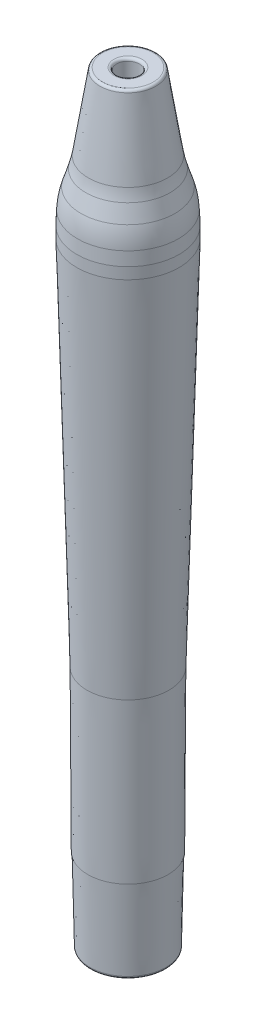
ISO-10303-21;
HEADER;
FILE_DESCRIPTION(('STEP AP214'),'2;1');
FILE_NAME('part.step','',(''),(''),'','','');
FILE_SCHEMA(('AUTOMOTIVE_DESIGN { 1 0 10303 214 1 1 1 1 }'));
ENDSEC;
DATA;
#1=APPLICATION_CONTEXT('core data for automotive mechanical design processes');
#2=APPLICATION_PROTOCOL_DEFINITION('international standard','automotive_design',2000,#1);
#3=PRODUCT_CONTEXT('',#1,'mechanical');
#4=PRODUCT('Part','Part','',(#3));
#5=PRODUCT_RELATED_PRODUCT_CATEGORY('part','',(#4));
#6=PRODUCT_DEFINITION_FORMATION('','',#4);
#7=PRODUCT_DEFINITION_CONTEXT('part definition',#1,'design');
#8=PRODUCT_DEFINITION('design','',#6,#7);
#9=PRODUCT_DEFINITION_SHAPE('','',#8);
#10=(LENGTH_UNIT() NAMED_UNIT(*) SI_UNIT(.MILLI.,.METRE.));
#11=(NAMED_UNIT(*) PLANE_ANGLE_UNIT() SI_UNIT($,.RADIAN.));
#12=(NAMED_UNIT(*) SI_UNIT($,.STERADIAN.) SOLID_ANGLE_UNIT());
#13=UNCERTAINTY_MEASURE_WITH_UNIT(LENGTH_MEASURE(1.E-05),#10,'distance_accuracy_value','');
#14=(GEOMETRIC_REPRESENTATION_CONTEXT(3) GLOBAL_UNCERTAINTY_ASSIGNED_CONTEXT((#13)) GLOBAL_UNIT_ASSIGNED_CONTEXT((#10,
#11,#12)) REPRESENTATION_CONTEXT('',''));
#15=CARTESIAN_POINT('',(0.,0.,0.));
#16=DIRECTION('',(0.,0.,1.));
#17=DIRECTION('',(1.,0.,0.));
#18=AXIS2_PLACEMENT_3D('',#15,#16,#17);
#19=CARTESIAN_POINT('',(14.187329425958,38.6453014595179,0.));
#20=DIRECTION('',(0.,1.,0.));
#21=DIRECTION('',(-1.,0.,0.));
#22=AXIS2_PLACEMENT_3D('',#19,#20,#21);
#23=CONICAL_SURFACE('',#22,9.44,0.0272708049812827);
#24=CARTESIAN_POINT('',(14.187329425958,-29.9091987574628,0.));
#25=DIRECTION('',(0.,-1.,0.));
#26=DIRECTION('',(1.,0.,0.));
#27=AXIS2_PLACEMENT_3D('',#24,#25,#26);
#28=CIRCLE('',#27,7.57000000000001);
#29=CARTESIAN_POINT('',(21.7573294259581,-29.9091987574628,0.));
#30=VERTEX_POINT('',#29);
#31=EDGE_CURVE('E74',#30,#30,#28,.T.);
#32=ORIENTED_EDGE('',*,*,#31,.F.);
#33=EDGE_LOOP('',(#32));
#34=FACE_BOUND('',#33,.T.);
#35=CARTESIAN_POINT('',(14.187329425958,38.6453014595179,0.));
#36=DIRECTION('',(0.,1.,0.));
#37=DIRECTION('',(0.,0.,1.));
#38=AXIS2_PLACEMENT_3D('',#35,#36,#37);
#39=CIRCLE('',#38,9.44);
#40=CARTESIAN_POINT('',(14.187329425958,38.6453014595179,9.44));
#41=VERTEX_POINT('',#40);
#42=EDGE_CURVE('E77',#41,#41,#39,.T.);
#43=ORIENTED_EDGE('',*,*,#42,.F.);
#44=EDGE_LOOP('',(#43));
#45=FACE_BOUND('',#44,.T.);
#46=ADVANCED_FACE('F48',(#34,#45),#23,.T.);
#47=CARTESIAN_POINT('',(14.187329425958,40.7453014595179,0.));
#48=DIRECTION('',(0.,1.,0.));
#49=DIRECTION('',(0.,0.,1.));
#50=AXIS2_PLACEMENT_3D('',#47,#48,#49);
#51=CYLINDRICAL_SURFACE('',#50,9.44);
#52=CARTESIAN_POINT('',(14.187329425958,40.7453014595179,0.));
#53=DIRECTION('',(0.,1.,0.));
#54=DIRECTION('',(0.,0.,1.));
#55=AXIS2_PLACEMENT_3D('',#52,#53,#54);
#56=CIRCLE('',#55,9.44);
#57=CARTESIAN_POINT('',(14.187329425958,40.7453014595179,9.44));
#58=VERTEX_POINT('',#57);
#59=EDGE_CURVE('E80',#58,#58,#56,.T.);
#60=ORIENTED_EDGE('',*,*,#59,.F.);
#61=EDGE_LOOP('',(#60));
#62=FACE_BOUND('',#61,.T.);
#63=ORIENTED_EDGE('',*,*,#42,.T.);
#64=EDGE_LOOP('',(#63));
#65=FACE_BOUND('',#64,.T.);
#66=ADVANCED_FACE('F122',(#62,#65),#51,.T.);
#67=CARTESIAN_POINT('',(16.287329425958,60.4653014595179,0.));
#68=DIRECTION('',(0.,-1.,0.));
#69=DIRECTION('',(1.,0.,0.));
#70=AXIS2_PLACEMENT_3D('',#67,#68,#69);
#71=PLANE('',#70);
#72=CARTESIAN_POINT('',(14.187329425958,60.4653014595179,0.));
#73=DIRECTION('',(0.,1.,0.));
#74=DIRECTION('',(-1.,0.,0.));
#75=AXIS2_PLACEMENT_3D('',#72,#73,#74);
#76=CIRCLE('',#75,2.1);
#77=CARTESIAN_POINT('',(12.087329425958,60.4653014595179,0.));
#78=VERTEX_POINT('',#77);
#79=EDGE_CURVE('E83',#78,#78,#76,.T.);
#80=ORIENTED_EDGE('',*,*,#79,.T.);
#81=EDGE_LOOP('',(#80));
#82=FACE_BOUND('',#81,.T.);
#83=ADVANCED_FACE('F128',(#82),#71,.F.);
#84=CARTESIAN_POINT('',(14.187329425958,60.4653014595179,0.));
#85=DIRECTION('',(0.,1.,0.));
#86=DIRECTION('',(-1.,0.,0.));
#87=AXIS2_PLACEMENT_3D('',#84,#85,#86);
#88=CYLINDRICAL_SURFACE('',#87,2.1);
#89=CARTESIAN_POINT('',(14.187329425958,65.4653014595179,0.));
#90=DIRECTION('',(0.,-1.,0.));
#91=DIRECTION('',(1.,0.,0.));
#92=AXIS2_PLACEMENT_3D('',#89,#90,#91);
#93=CIRCLE('',#92,2.1);
#94=CARTESIAN_POINT('',(16.287329425958,65.4653014595179,0.));
#95=VERTEX_POINT('',#94);
#96=EDGE_CURVE('E71',#95,#95,#93,.F.);
#97=ORIENTED_EDGE('',*,*,#96,.T.);
#98=EDGE_LOOP('',(#97));
#99=FACE_BOUND('',#98,.T.);
#100=ORIENTED_EDGE('',*,*,#79,.F.);
#101=EDGE_LOOP('',(#100));
#102=FACE_BOUND('',#101,.T.);
#103=ADVANCED_FACE('F152',(#99,#102),#88,.F.);
#104=CARTESIAN_POINT('',(19.297329425958,65.9653014595179,0.));
#105=DIRECTION('',(0.,-1.,0.));
#106=DIRECTION('',(1.,0.,0.));
#107=AXIS2_PLACEMENT_3D('',#104,#105,#106);
#108=PLANE('',#107);
#109=CARTESIAN_POINT('',(14.187329425958,65.9653014595179,0.));
#110=DIRECTION('',(0.,-1.,0.));
#111=DIRECTION('',(1.,0.,0.));
#112=AXIS2_PLACEMENT_3D('',#109,#110,#111);
#113=CIRCLE('',#112,2.6);
#114=CARTESIAN_POINT('',(16.787329425958,65.9653014595179,0.));
#115=VERTEX_POINT('',#114);
#116=EDGE_CURVE('E63',#115,#115,#113,.T.);
#117=ORIENTED_EDGE('',*,*,#116,.T.);
#118=EDGE_LOOP('',(#117));
#119=FACE_BOUND('',#118,.T.);
#120=CARTESIAN_POINT('',(14.187329425958,65.9653014595179,0.));
#121=DIRECTION('',(0.,-1.,0.));
#122=DIRECTION('',(1.,0.,0.));
#123=AXIS2_PLACEMENT_3D('',#120,#121,#122);
#124=CIRCLE('',#123,4.6818583130717);
#125=CARTESIAN_POINT('',(18.8691877390297,65.9653014595179,0.));
#126=VERTEX_POINT('',#125);
#127=EDGE_CURVE('E68',#126,#126,#124,.F.);
#128=ORIENTED_EDGE('',*,*,#127,.T.);
#129=EDGE_LOOP('',(#128));
#130=FACE_BOUND('',#129,.T.);
#131=ADVANCED_FACE('F149',(#119,#130),#108,.F.);
#132=CARTESIAN_POINT('',(14.187329425958,51.9145218271031,0.));
#133=DIRECTION('',(0.,-1.,0.));
#134=DIRECTION('',(1.,0.,0.));
#135=AXIS2_PLACEMENT_3D('',#132,#133,#134);
#136=CONICAL_SURFACE('',#135,7.29879054189858,0.154535137143892);
#137=CARTESIAN_POINT('',(14.187329425958,65.5422618559004,0.));
#138=DIRECTION('',(0.,1.,0.));
#139=DIRECTION('',(-1.,0.,0.));
#140=AXIS2_PLACEMENT_3D('',#137,#138,#139);
#141=CIRCLE('',#140,5.17589990786777);
#142=CARTESIAN_POINT('',(9.01142951809026,65.5422618559004,0.));
#143=VERTEX_POINT('',#142);
#144=EDGE_CURVE('E59',#143,#143,#141,.F.);
#145=ORIENTED_EDGE('',*,*,#144,.T.);
#146=EDGE_LOOP('',(#145));
#147=FACE_BOUND('',#146,.T.);
#148=CARTESIAN_POINT('',(14.187329425958,51.9145218271031,0.));
#149=DIRECTION('',(0.,1.,0.));
#150=DIRECTION('',(-1.,0.,0.));
#151=AXIS2_PLACEMENT_3D('',#148,#149,#150);
#152=CIRCLE('',#151,7.29879054189858);
#153=CARTESIAN_POINT('',(6.88853888405945,51.9145218271031,0.));
#154=VERTEX_POINT('',#153);
#155=EDGE_CURVE('E86',#154,#154,#152,.T.);
#156=ORIENTED_EDGE('',*,*,#155,.T.);
#157=EDGE_LOOP('',(#156));
#158=FACE_BOUND('',#157,.T.);
#159=ADVANCED_FACE('F151',(#147,#158),#136,.T.);
#160=CARTESIAN_POINT('',(14.187329425958,54.2233337185788,0.));
#161=DIRECTION('',(0.,1.,0.));
#162=DIRECTION('',(-1.,0.,0.));
#163=AXIS2_PLACEMENT_3D('',#160,#161,#162);
#164=TOROIDAL_SURFACE('',#163,22.1200383857807,15.);
#165=ORIENTED_EDGE('',*,*,#155,.F.);
#166=EDGE_LOOP('',(#165));
#167=FACE_BOUND('',#166,.T.);
#168=CARTESIAN_POINT('',(14.187329425958,49.8037438270688,0.));
#169=DIRECTION('',(0.,1.,0.));
#170=DIRECTION('',(-1.,0.,0.));
#171=AXIS2_PLACEMENT_3D('',#168,#169,#170);
#172=CIRCLE('',#171,7.785910397275);
#173=CARTESIAN_POINT('',(6.40141902868303,49.8037438270688,0.));
#174=VERTEX_POINT('',#173);
#175=EDGE_CURVE('E89',#174,#174,#172,.T.);
#176=ORIENTED_EDGE('',*,*,#175,.T.);
#177=EDGE_LOOP('',(#176));
#178=FACE_BOUND('',#177,.T.);
#179=ADVANCED_FACE('F159',(#167,#178),#164,.F.);
#180=CARTESIAN_POINT('',(14.187329425958,46.9163126616971,0.));
#181=DIRECTION('',(0.,-1.,0.));
#182=DIRECTION('',(1.,0.,0.));
#183=AXIS2_PLACEMENT_3D('',#180,#181,#182);
#184=CONICAL_SURFACE('',#183,8.67618161580606,0.299078068193188);
#185=ORIENTED_EDGE('',*,*,#175,.F.);
#186=EDGE_LOOP('',(#185));
#187=FACE_BOUND('',#186,.T.);
#188=CARTESIAN_POINT('',(14.187329425958,46.9163126616971,0.));
#189=DIRECTION('',(0.,1.,0.));
#190=DIRECTION('',(-1.,0.,0.));
#191=AXIS2_PLACEMENT_3D('',#188,#189,#190);
#192=CIRCLE('',#191,8.67618161580606);
#193=CARTESIAN_POINT('',(5.51114781015196,46.9163126616971,0.));
#194=VERTEX_POINT('',#193);
#195=EDGE_CURVE('E92',#194,#194,#192,.T.);
#196=ORIENTED_EDGE('',*,*,#195,.T.);
#197=EDGE_LOOP('',(#196));
#198=FACE_BOUND('',#197,.T.);
#199=ADVANCED_FACE('F263',(#187,#198),#184,.T.);
#200=CARTESIAN_POINT('',(14.187329425958,42.4967227701871,0.));
#201=DIRECTION('',(0.,1.,0.));
#202=DIRECTION('',(-1.,0.,0.));
#203=AXIS2_PLACEMENT_3D('',#200,#201,#202);
#204=DEGENERATE_TOROIDAL_SURFACE('',#203,5.65794637269964,15.,.F.);
#205=ORIENTED_EDGE('',*,*,#195,.F.);
#206=EDGE_LOOP('',(#205));
#207=FACE_BOUND('',#206,.T.);
#208=CARTESIAN_POINT('',(14.187329425958,43.1952840589331,0.));
#209=DIRECTION('',(0.,1.,0.));
#210=DIRECTION('',(-1.,0.,0.));
#211=AXIS2_PLACEMENT_3D('',#208,#209,#210);
#212=CIRCLE('',#211,9.32577853554215);
#213=CARTESIAN_POINT('',(4.86155089041588,43.1952840589331,0.));
#214=VERTEX_POINT('',#213);
#215=EDGE_CURVE('E95',#214,#214,#212,.T.);
#216=ORIENTED_EDGE('',*,*,#215,.T.);
#217=EDGE_LOOP('',(#216));
#218=FACE_BOUND('',#217,.T.);
#219=ADVANCED_FACE('F254',(#207,#218),#204,.F.);
#220=CARTESIAN_POINT('',(14.187329425958,40.7453014595179,0.));
#221=DIRECTION('',(0.,-1.,0.));
#222=DIRECTION('',(1.,0.,0.));
#223=AXIS2_PLACEMENT_3D('',#220,#221,#222);
#224=CONICAL_SURFACE('',#223,9.44,0.0465876030802658);
#225=ORIENTED_EDGE('',*,*,#215,.F.);
#226=EDGE_LOOP('',(#225));
#227=FACE_BOUND('',#226,.T.);
#228=ORIENTED_EDGE('',*,*,#59,.T.);
#229=EDGE_LOOP('',(#228));
#230=FACE_BOUND('',#229,.T.);
#231=ADVANCED_FACE('F118',(#227,#230),#224,.T.);
#232=CARTESIAN_POINT('',(14.187329425958,-59.4788183018533,0.));
#233=DIRECTION('',(0.,1.,0.));
#234=DIRECTION('',(0.,0.,1.));
#235=AXIS2_PLACEMENT_3D('',#232,#233,#234);
#236=CONICAL_SURFACE('',#235,7.42,0.00507273058223982);
#237=ORIENTED_EDGE('',*,*,#31,.T.);
#238=EDGE_LOOP('',(#237));
#239=FACE_BOUND('',#238,.T.);
#240=CARTESIAN_POINT('',(14.187329425958,-59.4788183018533,0.));
#241=DIRECTION('',(0.,-1.,0.));
#242=DIRECTION('',(0.,0.,-1.));
#243=AXIS2_PLACEMENT_3D('',#240,#241,#242);
#244=CIRCLE('',#243,7.42);
#245=CARTESIAN_POINT('',(14.187329425958,-59.4788183018533,-7.42));
#246=VERTEX_POINT('',#245);
#247=EDGE_CURVE('E98',#246,#246,#244,.T.);
#248=ORIENTED_EDGE('',*,*,#247,.F.);
#249=EDGE_LOOP('',(#248));
#250=FACE_BOUND('',#249,.T.);
#251=ADVANCED_FACE('F109',(#239,#250),#236,.T.);
#252=CARTESIAN_POINT('',(21.607329425958,-59.4788183018533,0.));
#253=DIRECTION('',(0.,-1.,0.));
#254=DIRECTION('',(0.,0.,-1.));
#255=AXIS2_PLACEMENT_3D('',#252,#253,#254);
#256=PLANE('',#255);
#257=ORIENTED_EDGE('',*,*,#247,.T.);
#258=EDGE_LOOP('',(#257));
#259=FACE_BOUND('',#258,.T.);
#260=CARTESIAN_POINT('',(14.187329425958,-59.4788183018533,0.));
#261=DIRECTION('',(0.,-1.,0.));
#262=DIRECTION('',(0.,0.,-1.));
#263=AXIS2_PLACEMENT_3D('',#260,#261,#262);
#264=CIRCLE('',#263,7.31);
#265=CARTESIAN_POINT('',(14.187329425958,-59.4788183018533,-7.31));
#266=VERTEX_POINT('',#265);
#267=EDGE_CURVE('E101',#266,#266,#264,.T.);
#268=ORIENTED_EDGE('',*,*,#267,.F.);
#269=EDGE_LOOP('',(#268));
#270=FACE_BOUND('',#269,.T.);
#271=ADVANCED_FACE('F107',(#259,#270),#256,.T.);
#272=CARTESIAN_POINT('',(14.187329425958,-75.0270060407301,0.));
#273=DIRECTION('',(0.,1.,0.));
#274=DIRECTION('',(0.,0.,1.));
#275=AXIS2_PLACEMENT_3D('',#272,#273,#274);
#276=CONICAL_SURFACE('',#275,6.99,0.0205782715304563);
#277=CARTESIAN_POINT('',(14.187329425958,-74.5372944503287,0.));
#278=DIRECTION('',(0.,-1.,0.));
#279=DIRECTION('',(0.,0.,-1.));
#280=AXIS2_PLACEMENT_3D('',#277,#278,#279);
#281=CIRCLE('',#280,7.0000788407987);
#282=CARTESIAN_POINT('',(14.187329425958,-74.5372944503287,-7.0000788407987));
#283=VERTEX_POINT('',#282);
#284=EDGE_CURVE('E11',#283,#283,#281,.F.);
#285=ORIENTED_EDGE('',*,*,#284,.T.);
#286=EDGE_LOOP('',(#285));
#287=FACE_BOUND('',#286,.T.);
#288=ORIENTED_EDGE('',*,*,#267,.T.);
#289=EDGE_LOOP('',(#288));
#290=FACE_BOUND('',#289,.T.);
#291=ADVANCED_FACE('F105',(#287,#290),#276,.T.);
#292=CARTESIAN_POINT('',(21.177329425958,-75.0270060407301,0.));
#293=DIRECTION('',(0.,-1.,0.));
#294=DIRECTION('',(0.,0.,-1.));
#295=AXIS2_PLACEMENT_3D('',#292,#293,#294);
#296=PLANE('',#295);
#297=CARTESIAN_POINT('',(14.187329425958,-75.0270060407301,0.));
#298=DIRECTION('',(0.,-1.,0.));
#299=DIRECTION('',(0.,0.,-1.));
#300=AXIS2_PLACEMENT_3D('',#297,#298,#299);
#301=CIRCLE('',#300,6.50018470337765);
#302=CARTESIAN_POINT('',(14.187329425958,-75.0270060407301,-6.50018470337765));
#303=VERTEX_POINT('',#302);
#304=EDGE_CURVE('E55',#303,#303,#301,.T.);
#305=ORIENTED_EDGE('',*,*,#304,.T.);
#306=EDGE_LOOP('',(#305));
#307=FACE_BOUND('',#306,.T.);
#308=ADVANCED_FACE('F116',(#307),#296,.T.);
#309=CARTESIAN_POINT('',(14.187329425958,65.4653014595179,0.));
#310=DIRECTION('',(0.,-1.,0.));
#311=DIRECTION('',(1.,0.,0.));
#312=AXIS2_PLACEMENT_3D('',#309,#310,#311);
#313=TOROIDAL_SURFACE('',#312,2.6,0.5);
#314=ORIENTED_EDGE('',*,*,#116,.F.);
#315=EDGE_LOOP('',(#314));
#316=FACE_BOUND('',#315,.T.);
#317=ORIENTED_EDGE('',*,*,#96,.F.);
#318=EDGE_LOOP('',(#317));
#319=FACE_BOUND('',#318,.T.);
#320=ADVANCED_FACE('F135',(#316,#319),#313,.T.);
#321=CARTESIAN_POINT('',(14.187329425958,65.4653014595179,0.));
#322=DIRECTION('',(0.,-1.,0.));
#323=DIRECTION('',(1.,0.,0.));
#324=AXIS2_PLACEMENT_3D('',#321,#322,#323);
#325=TOROIDAL_SURFACE('',#324,4.6818583130717,0.5);
#326=ORIENTED_EDGE('',*,*,#144,.F.);
#327=EDGE_LOOP('',(#326));
#328=FACE_BOUND('',#327,.T.);
#329=ORIENTED_EDGE('',*,*,#127,.F.);
#330=EDGE_LOOP('',(#329));
#331=FACE_BOUND('',#330,.T.);
#332=ADVANCED_FACE('F137',(#328,#331),#325,.T.);
#333=CARTESIAN_POINT('',(14.187329425958,-74.5270060407301,0.));
#334=DIRECTION('',(0.,-1.,0.));
#335=DIRECTION('',(0.,0.,-1.));
#336=AXIS2_PLACEMENT_3D('',#333,#334,#335);
#337=TOROIDAL_SURFACE('',#336,6.50018470337765,0.5);
#338=ORIENTED_EDGE('',*,*,#284,.F.);
#339=EDGE_LOOP('',(#338));
#340=FACE_BOUND('',#339,.T.);
#341=ORIENTED_EDGE('',*,*,#304,.F.);
#342=EDGE_LOOP('',(#341));
#343=FACE_BOUND('',#342,.T.);
#344=ADVANCED_FACE('F50',(#340,#343),#337,.T.);
#345=CLOSED_SHELL('',(#46,#66,#83,#103,#131,#159,#179,#199,#219,#231,#251,#271,#291,#308,#320,
#332,#344));
#346=MANIFOLD_SOLID_BREP('B2',#345);
#347=ADVANCED_BREP_SHAPE_REPRESENTATION('',(#18,#346),#14);
#348=SHAPE_DEFINITION_REPRESENTATION(#9,#347);
ENDSEC;
END-ISO-10303-21;
